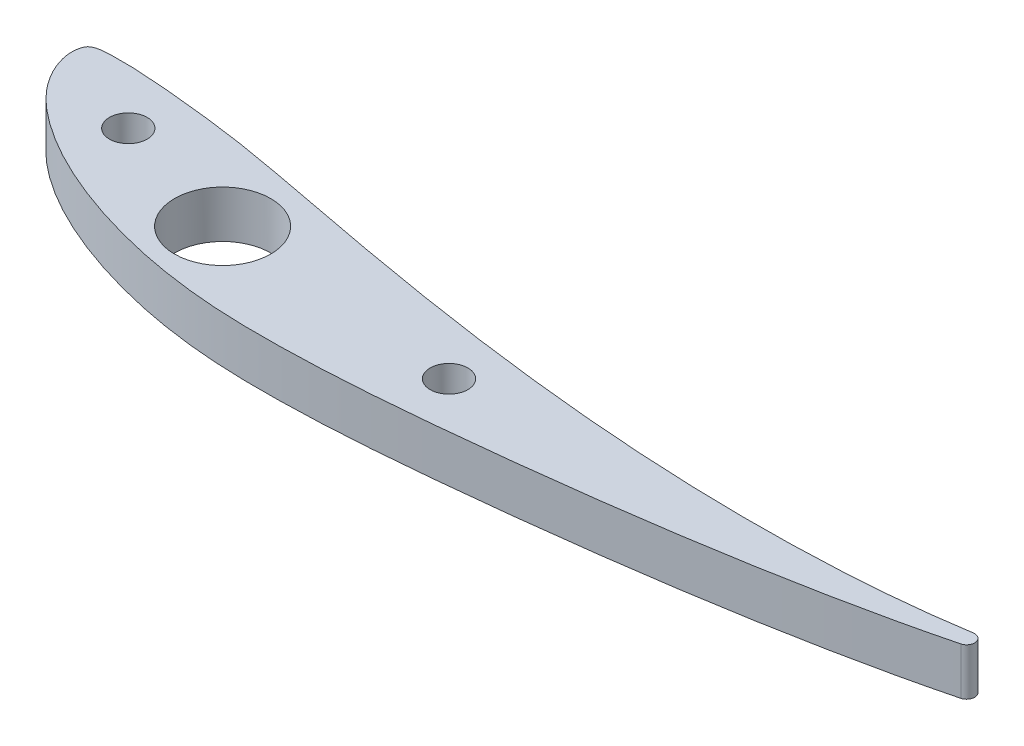
ISO-10303-21;
HEADER;
FILE_DESCRIPTION(('STEP AP214'),'2;1');
FILE_NAME('part.step','',(''),(''),'','','');
FILE_SCHEMA(('AUTOMOTIVE_DESIGN { 1 0 10303 214 1 1 1 1 }'));
ENDSEC;
DATA;
#1=APPLICATION_CONTEXT('core data for automotive mechanical design processes');
#2=APPLICATION_PROTOCOL_DEFINITION('international standard','automotive_design',2000,#1);
#3=PRODUCT_CONTEXT('',#1,'mechanical');
#4=PRODUCT('Part','Part','',(#3));
#5=PRODUCT_RELATED_PRODUCT_CATEGORY('part','',(#4));
#6=PRODUCT_DEFINITION_FORMATION('','',#4);
#7=PRODUCT_DEFINITION_CONTEXT('part definition',#1,'design');
#8=PRODUCT_DEFINITION('design','',#6,#7);
#9=PRODUCT_DEFINITION_SHAPE('','',#8);
#10=(LENGTH_UNIT() NAMED_UNIT(*) SI_UNIT(.MILLI.,.METRE.));
#11=(NAMED_UNIT(*) PLANE_ANGLE_UNIT() SI_UNIT($,.RADIAN.));
#12=(NAMED_UNIT(*) SI_UNIT($,.STERADIAN.) SOLID_ANGLE_UNIT());
#13=UNCERTAINTY_MEASURE_WITH_UNIT(LENGTH_MEASURE(1.E-05),#10,'distance_accuracy_value','');
#14=(GEOMETRIC_REPRESENTATION_CONTEXT(3) GLOBAL_UNCERTAINTY_ASSIGNED_CONTEXT((#13)) GLOBAL_UNIT_ASSIGNED_CONTEXT((#10,
#11,#12)) REPRESENTATION_CONTEXT('',''));
#15=CARTESIAN_POINT('',(0.,0.,0.));
#16=DIRECTION('',(0.,0.,1.));
#17=DIRECTION('',(1.,0.,0.));
#18=AXIS2_PLACEMENT_3D('',#15,#16,#17);
#19=CARTESIAN_POINT('',(150.,6.35,0.));
#20=CARTESIAN_POINT('',(149.999082428381,6.35,-0.00389582009736034));
#21=CARTESIAN_POINT('',(149.419672052869,6.35,0.389722724012988));
#22=CARTESIAN_POINT('',(148.777054722267,6.35,0.778630866538724));
#23=CARTESIAN_POINT('',(147.104253470449,6.35,1.78360851317504));
#24=CARTESIAN_POINT('',(144.835255918469,6.35,2.8706596932561));
#25=CARTESIAN_POINT('',(141.654931000593,6.35,4.05876887414084));
#26=CARTESIAN_POINT('',(137.768772176686,6.35,5.17228657159229));
#27=CARTESIAN_POINT('',(133.222466898318,6.35,6.21322885215852));
#28=CARTESIAN_POINT('',(128.099790298759,6.35,7.12992514558185));
#29=CARTESIAN_POINT('',(122.460796636297,6.35,7.89171254868684));
#30=CARTESIAN_POINT('',(116.378899617892,6.35,8.4765179201686));
#31=CARTESIAN_POINT('',(109.926502556761,6.35,8.86194901902519));
#32=CARTESIAN_POINT('',(103.181194498135,6.35,9.04303469629438));
#33=CARTESIAN_POINT('',(96.2202124792049,6.35,9.01556347534483));
#34=CARTESIAN_POINT('',(89.1212177404967,6.35,8.78153799605502));
#35=CARTESIAN_POINT('',(81.9612254877642,6.35,8.35386710869585));
#36=CARTESIAN_POINT('',(74.8150435721909,6.35,7.74954211330183));
#37=CARTESIAN_POINT('',(67.7543890329753,6.35,6.98433613987588));
#38=CARTESIAN_POINT('',(60.8459682699353,6.35,6.09268798297516));
#39=CARTESIAN_POINT('',(54.1519129709237,6.35,5.10060814991434));
#40=CARTESIAN_POINT('',(47.7299218042865,6.35,4.04455437653392));
#41=CARTESIAN_POINT('',(41.6298263636063,6.35,2.95984773692774));
#42=CARTESIAN_POINT('',(35.8964372624995,6.35,1.8872593890185));
#43=CARTESIAN_POINT('',(30.5657792465604,6.35,0.871378580306832));
#44=CARTESIAN_POINT('',(25.6639152876827,6.35,-0.0620603139216886));
#45=CARTESIAN_POINT('',(21.1663777493916,6.35,-0.806236455276615));
#46=CARTESIAN_POINT('',(17.0512775954272,6.35,-1.33837616882425));
#47=CARTESIAN_POINT('',(13.3205931283221,6.35,-1.75315802660879));
#48=CARTESIAN_POINT('',(9.9925123734962,6.35,-2.05951632249805));
#49=CARTESIAN_POINT('',(7.10109213474704,6.35,-2.25049696083405));
#50=CARTESIAN_POINT('',(4.67850051945805,6.35,-2.35412859107688));
#51=CARTESIAN_POINT('',(2.75214635583227,6.35,-2.28571250716866));
#52=CARTESIAN_POINT('',(1.3439959058357,6.35,-2.21532201430732));
#53=CARTESIAN_POINT('',(0.296818428144317,6.35,-1.71669168240699));
#54=CARTESIAN_POINT('',(0.0154034725369719,6.35,-0.712842884516727));
#55=CARTESIAN_POINT('',(-0.0320359192426204,6.35,0.381585183657237));
#56=CARTESIAN_POINT('',(0.216127101284339,6.35,1.67549317939556));
#57=CARTESIAN_POINT('',(0.736478585984824,6.35,3.07725753828234));
#58=CARTESIAN_POINT('',(1.54814866536464,6.35,4.55355888811399));
#59=CARTESIAN_POINT('',(2.6468022104134,6.35,6.07094314969597));
#60=CARTESIAN_POINT('',(4.07694345004061,6.35,7.58257399099648));
#61=CARTESIAN_POINT('',(5.83176589681352,6.35,9.07535873582891));
#62=CARTESIAN_POINT('',(7.88583461059798,6.35,10.565607603347));
#63=CARTESIAN_POINT('',(10.238291416027,6.35,12.0217182709878));
#64=CARTESIAN_POINT('',(12.8743801617639,6.35,13.423953281501));
#65=CARTESIAN_POINT('',(15.7797567934294,6.35,14.7563611317161));
#66=CARTESIAN_POINT('',(18.9450960578764,6.35,15.9918730111008));
#67=CARTESIAN_POINT('',(22.3507285308281,6.35,17.1238704341557));
#68=CARTESIAN_POINT('',(25.9821629072986,6.35,18.1258591702171));
#69=CARTESIAN_POINT('',(29.8240294835818,6.35,18.9800756122586));
#70=CARTESIAN_POINT('',(33.8723652710562,6.35,19.6390793339999));
#71=CARTESIAN_POINT('',(38.1281478975344,6.35,20.1046513112587));
#72=CARTESIAN_POINT('',(42.6086861718545,6.35,20.3335787752028));
#73=CARTESIAN_POINT('',(47.3157220885382,6.35,20.3444131036094));
#74=CARTESIAN_POINT('',(52.2405056996449,6.35,20.225708000823));
#75=CARTESIAN_POINT('',(57.35779940524,6.35,19.952994498916));
#76=CARTESIAN_POINT('',(62.639144180053,6.35,19.5572775987887));
#77=CARTESIAN_POINT('',(68.0543775168331,6.35,19.0596198460294));
#78=CARTESIAN_POINT('',(73.5654214973001,6.35,18.4879403081999));
#79=CARTESIAN_POINT('',(79.1273805633575,6.35,17.8529185629785));
#80=CARTESIAN_POINT('',(84.6942136733634,6.35,17.1705453823487));
#81=CARTESIAN_POINT('',(90.2214146874856,6.35,16.4360180876635));
#82=CARTESIAN_POINT('',(95.6689490433948,6.35,15.6516948201266));
#83=CARTESIAN_POINT('',(101.001904956754,6.35,14.8237881075422));
#84=CARTESIAN_POINT('',(106.185791668959,6.35,13.9506967600955));
#85=CARTESIAN_POINT('',(111.190736161851,6.35,13.0436508102582));
#86=CARTESIAN_POINT('',(115.985219841489,6.35,12.1039545564814));
#87=CARTESIAN_POINT('',(120.541223190119,6.35,11.1431608499961));
#88=CARTESIAN_POINT('',(124.830924819146,6.35,10.1662104195704));
#89=CARTESIAN_POINT('',(128.828757145348,6.35,9.17920486900025));
#90=CARTESIAN_POINT('',(132.511800063579,6.35,8.1892870115532));
#91=CARTESIAN_POINT('',(135.85971864832,6.35,7.20554154204969));
#92=CARTESIAN_POINT('',(138.853765182208,6.35,6.23258673383291));
#93=CARTESIAN_POINT('',(141.478397693167,6.35,5.27886655467916));
#94=CARTESIAN_POINT('',(143.721372273851,6.35,4.35111616153216));
#95=CARTESIAN_POINT('',(145.579273929924,6.35,3.46224404255304));
#96=CARTESIAN_POINT('',(147.073285762808,6.35,2.54518803079009));
#97=CARTESIAN_POINT('',(148.165385918256,6.35,1.63564488717655));
#98=CARTESIAN_POINT('',(149.091049020767,6.35,0.780692200443918));
#99=CARTESIAN_POINT('',(149.507930169283,6.35,0.371377778407435));
#100=CARTESIAN_POINT('',(150.000899289152,6.35,0.00381819650754722));
#101=CARTESIAN_POINT('',(150.,6.35,0.));
#102=B_SPLINE_CURVE_WITH_KNOTS('',3,(#19,#20,#21,#22,#23,#24,#25,#26,#27,#28,#29,#30,#31,#32,
#33,#34,#35,#36,#37,#38,#39,#40,#41,#42,#43,#44,#45,#46,#47,#48,#49,#50,#51,#52,#53,#54,#55,#56,
#57,#58,#59,#60,#61,#62,#63,#64,#65,#66,#67,#68,#69,#70,#71,#72,#73,#74,#75,#76,#77,#78,#79,#80,
#81,#82,#83,#84,#85,#86,#87,#88,#89,#90,#91,#92,#93,#94,#95,#96,#97,#98,#99,#100,#101),
.UNSPECIFIED.,.T.,.F.,(4,1,1,1,1,1,1,1,1,1,1,1,1,1,1,1,1,1,1,1,1,1,1,1,1,1,1,1,1,1,1,1,1,1,1,1,
1,1,1,1,1,1,1,1,1,1,1,1,1,1,1,1,1,1,1,1,1,1,1,1,1,1,1,1,1,1,1,1,1,1,1,1,1,1,1,1,1,1,1,1,4),(0.,
0.000999594313299323,0.00414743475003776,0.00974820897402395,0.0180443769200241,
0.0288641783652488,0.0418307896412056,0.056713806957678,0.0733412324180671,0.0915079886594421,
0.111021837040934,0.131661709492213,0.153207715119588,0.175433402170293,0.198110317315045,
0.221011446315139,0.243905882495844,0.266573311035611,0.288810349135398,0.310405035997316,
0.331177743204304,0.350943876391454,0.369556399670184,0.386864963345299,0.402753039208367,
0.417195875784384,0.430379518903367,0.44236263317429,0.453032155511854,0.462284345612073,
0.470026206002306,0.476176644820514,0.4806499474091,0.483553073373249,0.486420689318958,
0.489953231463337,0.49409692674396,0.498850588304448,0.504196750280793,0.510125492183598,
0.516691031253851,0.524011699263473,0.532092122465354,0.540897920896839,0.550403413935838,
0.560581040891741,0.571396483088815,0.582828080950065,0.594829641292505,0.607347037120814,
0.620384325080165,0.633968936607919,0.648199967415963,0.663193936825189,0.678898580785939,
0.695226562400326,0.712113220733956,0.729459406270428,0.747143116877991,0.765009771536014,
0.782904928287736,0.800688045055655,0.818242104849469,0.835449083117584,0.852211620697039,
0.868429578359411,0.884009362888173,0.898854951230209,0.912881826809319,0.926010749515415,
0.938166770937821,0.949289699209522,0.959322171916738,0.968216949447241,0.975948220006129,
0.982474409223121,0.987904722814407,0.992516501480522,0.996351137832237,0.999020322442866,1.),.UNSPECIFIED.);
#103=DIRECTION('',(0.,-1.,0.));
#104=VECTOR('',#103,1.);
#105=SURFACE_OF_LINEAR_EXTRUSION('',#102,#104);
#106=DIRECTION('',(0.,-1.,0.));
#107=VECTOR('',#106,1.);
#108=CARTESIAN_POINT('',(128.887264336441,6.35,9.15007648111376));
#109=LINE('',#108,#107);
#110=CARTESIAN_POINT('',(128.887264336436,0.,9.15007648111498));
#111=VERTEX_POINT('',#110);
#112=CARTESIAN_POINT('',(128.887264336436,6.35,9.15007648111506));
#113=VERTEX_POINT('',#112);
#114=EDGE_CURVE('E68',#111,#113,#109,.F.);
#115=ORIENTED_EDGE('',*,*,#114,.T.);
#116=CARTESIAN_POINT('',(128.505603589978,6.35,7.02617768179057));
#117=VERTEX_POINT('',#116);
#118=EDGE_CURVE('E43',#117,#113,#102,.T.);
#119=ORIENTED_EDGE('',*,*,#118,.F.);
#120=DIRECTION('',(0.,-1.,0.));
#121=VECTOR('',#120,1.);
#122=CARTESIAN_POINT('',(128.505603589978,6.35,7.02617768179148));
#123=LINE('',#122,#121);
#124=CARTESIAN_POINT('',(128.505603589978,0.,7.02617768179057));
#125=VERTEX_POINT('',#124);
#126=EDGE_CURVE('E60',#117,#125,#123,.T.);
#127=ORIENTED_EDGE('',*,*,#126,.T.);
#128=CARTESIAN_POINT('',(150.,0.,0.));
#129=CARTESIAN_POINT('',(149.999082428381,0.,-0.00389582009736034));
#130=CARTESIAN_POINT('',(149.419672052869,0.,0.389722724012988));
#131=CARTESIAN_POINT('',(148.777054722267,0.,0.778630866538724));
#132=CARTESIAN_POINT('',(147.104253470449,0.,1.78360851317504));
#133=CARTESIAN_POINT('',(144.835255918469,0.,2.8706596932561));
#134=CARTESIAN_POINT('',(141.654931000593,0.,4.05876887414084));
#135=CARTESIAN_POINT('',(137.768772176686,0.,5.17228657159229));
#136=CARTESIAN_POINT('',(133.222466898318,0.,6.21322885215852));
#137=CARTESIAN_POINT('',(128.099790298759,0.,7.12992514558185));
#138=CARTESIAN_POINT('',(122.460796636297,0.,7.89171254868684));
#139=CARTESIAN_POINT('',(116.378899617892,0.,8.4765179201686));
#140=CARTESIAN_POINT('',(109.926502556761,0.,8.86194901902519));
#141=CARTESIAN_POINT('',(103.181194498135,0.,9.04303469629438));
#142=CARTESIAN_POINT('',(96.2202124792049,0.,9.01556347534483));
#143=CARTESIAN_POINT('',(89.1212177404967,0.,8.78153799605502));
#144=CARTESIAN_POINT('',(81.9612254877642,0.,8.35386710869585));
#145=CARTESIAN_POINT('',(74.8150435721909,0.,7.74954211330183));
#146=CARTESIAN_POINT('',(67.7543890329753,0.,6.98433613987588));
#147=CARTESIAN_POINT('',(60.8459682699353,0.,6.09268798297516));
#148=CARTESIAN_POINT('',(54.1519129709237,0.,5.10060814991434));
#149=CARTESIAN_POINT('',(47.7299218042865,0.,4.04455437653392));
#150=CARTESIAN_POINT('',(41.6298263636063,0.,2.95984773692774));
#151=CARTESIAN_POINT('',(35.8964372624995,0.,1.8872593890185));
#152=CARTESIAN_POINT('',(30.5657792465604,0.,0.871378580306832));
#153=CARTESIAN_POINT('',(25.6639152876827,0.,-0.0620603139216886));
#154=CARTESIAN_POINT('',(21.1663777493916,0.,-0.806236455276615));
#155=CARTESIAN_POINT('',(17.0512775954272,0.,-1.33837616882425));
#156=CARTESIAN_POINT('',(13.3205931283221,0.,-1.75315802660879));
#157=CARTESIAN_POINT('',(9.9925123734962,0.,-2.05951632249805));
#158=CARTESIAN_POINT('',(7.10109213474704,0.,-2.25049696083405));
#159=CARTESIAN_POINT('',(4.67850051945805,0.,-2.35412859107688));
#160=CARTESIAN_POINT('',(2.75214635583227,0.,-2.28571250716866));
#161=CARTESIAN_POINT('',(1.3439959058357,0.,-2.21532201430732));
#162=CARTESIAN_POINT('',(0.296818428144317,0.,-1.71669168240699));
#163=CARTESIAN_POINT('',(0.0154034725369719,0.,-0.712842884516727));
#164=CARTESIAN_POINT('',(-0.0320359192426204,0.,0.381585183657237));
#165=CARTESIAN_POINT('',(0.216127101284339,0.,1.67549317939556));
#166=CARTESIAN_POINT('',(0.736478585984824,0.,3.07725753828234));
#167=CARTESIAN_POINT('',(1.54814866536464,0.,4.55355888811399));
#168=CARTESIAN_POINT('',(2.6468022104134,0.,6.07094314969597));
#169=CARTESIAN_POINT('',(4.07694345004061,0.,7.58257399099648));
#170=CARTESIAN_POINT('',(5.83176589681352,0.,9.07535873582891));
#171=CARTESIAN_POINT('',(7.88583461059798,0.,10.565607603347));
#172=CARTESIAN_POINT('',(10.238291416027,0.,12.0217182709878));
#173=CARTESIAN_POINT('',(12.8743801617639,0.,13.423953281501));
#174=CARTESIAN_POINT('',(15.7797567934294,0.,14.7563611317161));
#175=CARTESIAN_POINT('',(18.9450960578764,0.,15.9918730111008));
#176=CARTESIAN_POINT('',(22.3507285308281,0.,17.1238704341557));
#177=CARTESIAN_POINT('',(25.9821629072986,0.,18.1258591702171));
#178=CARTESIAN_POINT('',(29.8240294835818,0.,18.9800756122586));
#179=CARTESIAN_POINT('',(33.8723652710562,0.,19.6390793339999));
#180=CARTESIAN_POINT('',(38.1281478975344,0.,20.1046513112587));
#181=CARTESIAN_POINT('',(42.6086861718545,0.,20.3335787752028));
#182=CARTESIAN_POINT('',(47.3157220885382,0.,20.3444131036094));
#183=CARTESIAN_POINT('',(52.2405056996449,0.,20.225708000823));
#184=CARTESIAN_POINT('',(57.35779940524,0.,19.952994498916));
#185=CARTESIAN_POINT('',(62.639144180053,0.,19.5572775987887));
#186=CARTESIAN_POINT('',(68.0543775168331,0.,19.0596198460294));
#187=CARTESIAN_POINT('',(73.5654214973001,0.,18.4879403081999));
#188=CARTESIAN_POINT('',(79.1273805633575,0.,17.8529185629785));
#189=CARTESIAN_POINT('',(84.6942136733634,0.,17.1705453823487));
#190=CARTESIAN_POINT('',(90.2214146874856,0.,16.4360180876635));
#191=CARTESIAN_POINT('',(95.6689490433948,0.,15.6516948201266));
#192=CARTESIAN_POINT('',(101.001904956754,0.,14.8237881075422));
#193=CARTESIAN_POINT('',(106.185791668959,0.,13.9506967600955));
#194=CARTESIAN_POINT('',(111.190736161851,0.,13.0436508102582));
#195=CARTESIAN_POINT('',(115.985219841489,0.,12.1039545564814));
#196=CARTESIAN_POINT('',(120.541223190119,0.,11.1431608499961));
#197=CARTESIAN_POINT('',(124.830924819146,0.,10.1662104195704));
#198=CARTESIAN_POINT('',(128.828757145348,0.,9.17920486900025));
#199=CARTESIAN_POINT('',(132.511800063579,0.,8.1892870115532));
#200=CARTESIAN_POINT('',(135.85971864832,0.,7.20554154204969));
#201=CARTESIAN_POINT('',(138.853765182208,0.,6.23258673383291));
#202=CARTESIAN_POINT('',(141.478397693167,0.,5.27886655467916));
#203=CARTESIAN_POINT('',(143.721372273851,0.,4.35111616153216));
#204=CARTESIAN_POINT('',(145.579273929924,0.,3.46224404255304));
#205=CARTESIAN_POINT('',(147.073285762808,0.,2.54518803079009));
#206=CARTESIAN_POINT('',(148.165385918256,0.,1.63564488717655));
#207=CARTESIAN_POINT('',(149.091049020767,0.,0.780692200443918));
#208=CARTESIAN_POINT('',(149.507930169283,0.,0.371377778407435));
#209=CARTESIAN_POINT('',(150.000899289152,0.,0.00381819650754722));
#210=CARTESIAN_POINT('',(150.,0.,0.));
#211=B_SPLINE_CURVE_WITH_KNOTS('',3,(#128,#129,#130,#131,#132,#133,#134,#135,#136,#137,#138,
#139,#140,#141,#142,#143,#144,#145,#146,#147,#148,#149,#150,#151,#152,#153,#154,#155,#156,#157,
#158,#159,#160,#161,#162,#163,#164,#165,#166,#167,#168,#169,#170,#171,#172,#173,#174,#175,#176,
#177,#178,#179,#180,#181,#182,#183,#184,#185,#186,#187,#188,#189,#190,#191,#192,#193,#194,#195,
#196,#197,#198,#199,#200,#201,#202,#203,#204,#205,#206,#207,#208,#209,#210),.UNSPECIFIED.,.T.,
.F.,(4,1,1,1,1,1,1,1,1,1,1,1,1,1,1,1,1,1,1,1,1,1,1,1,1,1,1,1,1,1,1,1,1,1,1,1,1,1,1,1,1,1,1,1,1,
1,1,1,1,1,1,1,1,1,1,1,1,1,1,1,1,1,1,1,1,1,1,1,1,1,1,1,1,1,1,1,1,1,1,1,4),(0.,
0.000999594313299323,0.00414743475003776,0.00974820897402395,0.0180443769200241,
0.0288641783652488,0.0418307896412056,0.056713806957678,0.0733412324180671,0.0915079886594421,
0.111021837040934,0.131661709492213,0.153207715119588,0.175433402170293,0.198110317315045,
0.221011446315139,0.243905882495844,0.266573311035611,0.288810349135398,0.310405035997316,
0.331177743204304,0.350943876391454,0.369556399670184,0.386864963345299,0.402753039208367,
0.417195875784384,0.430379518903367,0.44236263317429,0.453032155511854,0.462284345612073,
0.470026206002306,0.476176644820514,0.4806499474091,0.483553073373249,0.486420689318958,
0.489953231463337,0.49409692674396,0.498850588304448,0.504196750280793,0.510125492183598,
0.516691031253851,0.524011699263473,0.532092122465354,0.540897920896839,0.550403413935838,
0.560581040891741,0.571396483088815,0.582828080950065,0.594829641292505,0.607347037120814,
0.620384325080165,0.633968936607919,0.648199967415963,0.663193936825189,0.678898580785939,
0.695226562400326,0.712113220733956,0.729459406270428,0.747143116877991,0.765009771536014,
0.782904928287736,0.800688045055655,0.818242104849469,0.835449083117584,0.852211620697039,
0.868429578359411,0.884009362888173,0.898854951230209,0.912881826809319,0.926010749515415,
0.938166770937821,0.949289699209522,0.959322171916738,0.968216949447241,0.975948220006129,
0.982474409223121,0.987904722814407,0.992516501480522,0.996351137832237,0.999020322442866,1.),.UNSPECIFIED.);
#212=EDGE_CURVE('E54',#125,#111,#211,.T.);
#213=ORIENTED_EDGE('',*,*,#212,.T.);
#214=EDGE_LOOP('',(#115,#119,#127,#213));
#215=FACE_BOUND('',#214,.T.);
#216=ADVANCED_FACE('F39',(#215),#105,.F.);
#217=CARTESIAN_POINT('',(0.900676601870592,6.35,3.33146790704024));
#218=DIRECTION('',(0.,-1.,0.));
#219=DIRECTION('',(0.,0.,-1.));
#220=AXIS2_PLACEMENT_3D('',#217,#218,#219);
#221=PLANE('',#220);
#222=CARTESIAN_POINT('',(12.7,6.35,5.08));
#223=DIRECTION('',(0.,-1.,0.));
#224=DIRECTION('',(0.,0.,-1.));
#225=AXIS2_PLACEMENT_3D('',#222,#223,#224);
#226=CIRCLE('',#225,2.54);
#227=CARTESIAN_POINT('',(12.7,6.35,2.54));
#228=VERTEX_POINT('',#227);
#229=EDGE_CURVE('E95',#228,#228,#226,.T.);
#230=ORIENTED_EDGE('',*,*,#229,.T.);
#231=EDGE_LOOP('',(#230));
#232=FACE_BOUND('',#231,.T.);
#233=CARTESIAN_POINT('',(63.5,6.35,12.7));
#234=DIRECTION('',(0.,-1.,0.));
#235=DIRECTION('',(0.,0.,-1.));
#236=AXIS2_PLACEMENT_3D('',#233,#234,#235);
#237=CIRCLE('',#236,2.54);
#238=CARTESIAN_POINT('',(63.5,6.35,10.16));
#239=VERTEX_POINT('',#238);
#240=EDGE_CURVE('E98',#239,#239,#237,.T.);
#241=ORIENTED_EDGE('',*,*,#240,.T.);
#242=EDGE_LOOP('',(#241));
#243=FACE_BOUND('',#242,.T.);
#244=CARTESIAN_POINT('',(30.48,6.35,10.16));
#245=DIRECTION('',(0.,-1.,0.));
#246=DIRECTION('',(0.,0.,-1.));
#247=AXIS2_PLACEMENT_3D('',#244,#245,#246);
#248=CIRCLE('',#247,6.47699999999999);
#249=CARTESIAN_POINT('',(30.48,6.35,3.68300000000001));
#250=VERTEX_POINT('',#249);
#251=EDGE_CURVE('E75',#250,#250,#248,.T.);
#252=ORIENTED_EDGE('',*,*,#251,.T.);
#253=EDGE_LOOP('',(#252));
#254=FACE_BOUND('',#253,.T.);
#255=ORIENTED_EDGE('',*,*,#118,.T.);
#256=CARTESIAN_POINT('',(128.59588995581,6.35,8.10619465648372));
#257=DIRECTION('',(0.,-1.,0.));
#258=DIRECTION('',(0.,0.,-1.));
#259=AXIS2_PLACEMENT_3D('',#256,#257,#258);
#260=CIRCLE('',#259,1.08378424673944);
#261=EDGE_CURVE('E107',#113,#117,#260,.F.);
#262=ORIENTED_EDGE('',*,*,#261,.T.);
#263=EDGE_LOOP('',(#255,#262));
#264=FACE_BOUND('',#263,.T.);
#265=ADVANCED_FACE('F109',(#232,#243,#254,#264),#221,.F.);
#266=CARTESIAN_POINT('',(0.900676601870592,0.,3.33146790704024));
#267=DIRECTION('',(0.,-1.,0.));
#268=DIRECTION('',(0.,0.,-1.));
#269=AXIS2_PLACEMENT_3D('',#266,#267,#268);
#270=PLANE('',#269);
#271=CARTESIAN_POINT('',(128.59588995581,0.,8.10619465648372));
#272=DIRECTION('',(0.,-1.,0.));
#273=DIRECTION('',(0.,0.,-1.));
#274=AXIS2_PLACEMENT_3D('',#271,#272,#273);
#275=CIRCLE('',#274,1.08378424673944);
#276=EDGE_CURVE('E11',#111,#125,#275,.F.);
#277=ORIENTED_EDGE('',*,*,#276,.F.);
#278=ORIENTED_EDGE('',*,*,#212,.F.);
#279=EDGE_LOOP('',(#277,#278));
#280=FACE_BOUND('',#279,.T.);
#281=CARTESIAN_POINT('',(12.7,0.,5.08));
#282=DIRECTION('',(0.,1.,0.));
#283=DIRECTION('',(0.,0.,1.));
#284=AXIS2_PLACEMENT_3D('',#281,#282,#283);
#285=CIRCLE('',#284,2.54);
#286=CARTESIAN_POINT('',(12.7,0.,7.62));
#287=VERTEX_POINT('',#286);
#288=EDGE_CURVE('E101',#287,#287,#285,.T.);
#289=ORIENTED_EDGE('',*,*,#288,.T.);
#290=EDGE_LOOP('',(#289));
#291=FACE_BOUND('',#290,.T.);
#292=CARTESIAN_POINT('',(63.5,0.,12.7));
#293=DIRECTION('',(0.,1.,0.));
#294=DIRECTION('',(0.,0.,1.));
#295=AXIS2_PLACEMENT_3D('',#292,#293,#294);
#296=CIRCLE('',#295,2.54);
#297=CARTESIAN_POINT('',(63.5,0.,15.24));
#298=VERTEX_POINT('',#297);
#299=EDGE_CURVE('E71',#298,#298,#296,.T.);
#300=ORIENTED_EDGE('',*,*,#299,.T.);
#301=EDGE_LOOP('',(#300));
#302=FACE_BOUND('',#301,.T.);
#303=CARTESIAN_POINT('',(30.48,0.,10.16));
#304=DIRECTION('',(0.,1.,0.));
#305=DIRECTION('',(0.,0.,1.));
#306=AXIS2_PLACEMENT_3D('',#303,#304,#305);
#307=CIRCLE('',#306,6.47699999999999);
#308=CARTESIAN_POINT('',(30.48,0.,16.637));
#309=VERTEX_POINT('',#308);
#310=EDGE_CURVE('E78',#309,#309,#307,.T.);
#311=ORIENTED_EDGE('',*,*,#310,.T.);
#312=EDGE_LOOP('',(#311));
#313=FACE_BOUND('',#312,.T.);
#314=ADVANCED_FACE('F73',(#280,#291,#302,#313),#270,.T.);
#315=CARTESIAN_POINT('',(30.48,0.,10.16));
#316=DIRECTION('',(0.,1.,0.));
#317=DIRECTION('',(0.,0.,1.));
#318=AXIS2_PLACEMENT_3D('',#315,#316,#317);
#319=CYLINDRICAL_SURFACE('',#318,6.47699999999999);
#320=ORIENTED_EDGE('',*,*,#310,.F.);
#321=EDGE_LOOP('',(#320));
#322=FACE_BOUND('',#321,.T.);
#323=ORIENTED_EDGE('',*,*,#251,.F.);
#324=EDGE_LOOP('',(#323));
#325=FACE_BOUND('',#324,.T.);
#326=ADVANCED_FACE('F117',(#322,#325),#319,.F.);
#327=CARTESIAN_POINT('',(63.5,0.,12.7));
#328=DIRECTION('',(0.,1.,0.));
#329=DIRECTION('',(0.,0.,1.));
#330=AXIS2_PLACEMENT_3D('',#327,#328,#329);
#331=CYLINDRICAL_SURFACE('',#330,2.54);
#332=ORIENTED_EDGE('',*,*,#299,.F.);
#333=EDGE_LOOP('',(#332));
#334=FACE_BOUND('',#333,.T.);
#335=ORIENTED_EDGE('',*,*,#240,.F.);
#336=EDGE_LOOP('',(#335));
#337=FACE_BOUND('',#336,.T.);
#338=ADVANCED_FACE('F122',(#334,#337),#331,.F.);
#339=CARTESIAN_POINT('',(12.7,0.,5.08));
#340=DIRECTION('',(0.,1.,0.));
#341=DIRECTION('',(0.,0.,1.));
#342=AXIS2_PLACEMENT_3D('',#339,#340,#341);
#343=CYLINDRICAL_SURFACE('',#342,2.54);
#344=ORIENTED_EDGE('',*,*,#288,.F.);
#345=EDGE_LOOP('',(#344));
#346=FACE_BOUND('',#345,.T.);
#347=ORIENTED_EDGE('',*,*,#229,.F.);
#348=EDGE_LOOP('',(#347));
#349=FACE_BOUND('',#348,.T.);
#350=ADVANCED_FACE('F126',(#346,#349),#343,.F.);
#351=CARTESIAN_POINT('',(128.59588995581,0.,8.10619465648372));
#352=DIRECTION('',(0.,1.,0.));
#353=DIRECTION('',(0.,0.,1.));
#354=AXIS2_PLACEMENT_3D('',#351,#352,#353);
#355=CYLINDRICAL_SURFACE('',#354,1.08378424673944);
#356=ORIENTED_EDGE('',*,*,#261,.F.);
#357=ORIENTED_EDGE('',*,*,#114,.F.);
#358=ORIENTED_EDGE('',*,*,#276,.T.);
#359=ORIENTED_EDGE('',*,*,#126,.F.);
#360=EDGE_LOOP('',(#356,#357,#358,#359));
#361=FACE_BOUND('',#360,.T.);
#362=ADVANCED_FACE('F67',(#361),#355,.T.);
#363=CLOSED_SHELL('',(#216,#265,#314,#326,#338,#350,#362));
#364=MANIFOLD_SOLID_BREP('B2',#363);
#365=ADVANCED_BREP_SHAPE_REPRESENTATION('',(#18,#364),#14);
#366=SHAPE_DEFINITION_REPRESENTATION(#9,#365);
ENDSEC;
END-ISO-10303-21;
